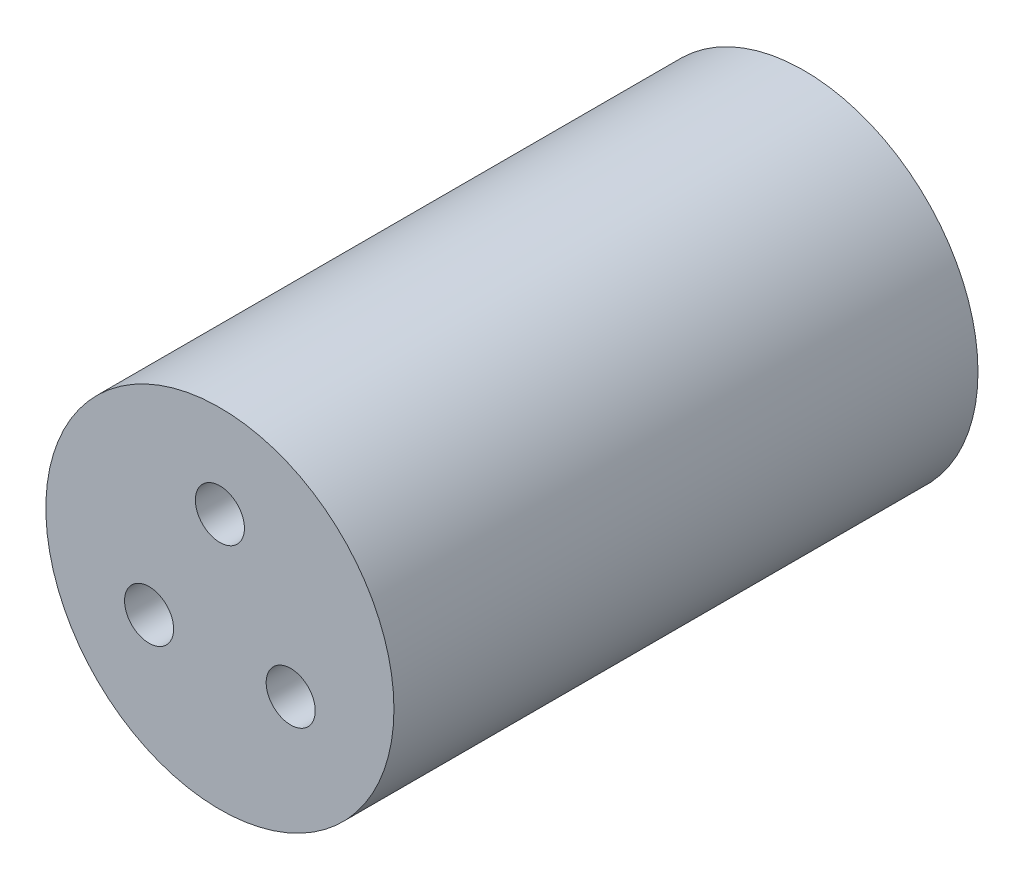
ISO-10303-21;
HEADER;
FILE_DESCRIPTION(('STEP AP214'),'2;1');
FILE_NAME('part.step','',(''),(''),'','','');
FILE_SCHEMA(('AUTOMOTIVE_DESIGN { 1 0 10303 214 1 1 1 1 }'));
ENDSEC;
DATA;
#1=APPLICATION_CONTEXT('core data for automotive mechanical design processes');
#2=APPLICATION_PROTOCOL_DEFINITION('international standard','automotive_design',2000,#1);
#3=PRODUCT_CONTEXT('',#1,'mechanical');
#4=PRODUCT('Part','Part','',(#3));
#5=PRODUCT_RELATED_PRODUCT_CATEGORY('part','',(#4));
#6=PRODUCT_DEFINITION_FORMATION('','',#4);
#7=PRODUCT_DEFINITION_CONTEXT('part definition',#1,'design');
#8=PRODUCT_DEFINITION('design','',#6,#7);
#9=PRODUCT_DEFINITION_SHAPE('','',#8);
#10=(LENGTH_UNIT() NAMED_UNIT(*) SI_UNIT(.MILLI.,.METRE.));
#11=(NAMED_UNIT(*) PLANE_ANGLE_UNIT() SI_UNIT($,.RADIAN.));
#12=(NAMED_UNIT(*) SI_UNIT($,.STERADIAN.) SOLID_ANGLE_UNIT());
#13=UNCERTAINTY_MEASURE_WITH_UNIT(LENGTH_MEASURE(1.E-05),#10,'distance_accuracy_value','');
#14=(GEOMETRIC_REPRESENTATION_CONTEXT(3) GLOBAL_UNCERTAINTY_ASSIGNED_CONTEXT((#13)) GLOBAL_UNIT_ASSIGNED_CONTEXT((#10,
#11,#12)) REPRESENTATION_CONTEXT('',''));
#15=CARTESIAN_POINT('',(0.,0.,0.));
#16=DIRECTION('',(0.,0.,1.));
#17=DIRECTION('',(1.,0.,0.));
#18=AXIS2_PLACEMENT_3D('',#15,#16,#17);
#19=CARTESIAN_POINT('',(0.,7.,50.));
#20=DIRECTION('',(0.,0.,-1.));
#21=DIRECTION('',(-1.,0.,0.));
#22=AXIS2_PLACEMENT_3D('',#19,#20,#21);
#23=CYLINDRICAL_SURFACE('',#22,1.7);
#24=CARTESIAN_POINT('',(0.,7.,44.3));
#25=DIRECTION('',(0.,0.,1.));
#26=DIRECTION('',(1.,0.,0.));
#27=AXIS2_PLACEMENT_3D('',#24,#25,#26);
#28=CIRCLE('',#27,1.7);
#29=CARTESIAN_POINT('',(1.7,7.,44.3));
#30=VERTEX_POINT('',#29);
#31=EDGE_CURVE('E58',#30,#30,#28,.T.);
#32=ORIENTED_EDGE('',*,*,#31,.T.);
#33=EDGE_LOOP('',(#32));
#34=FACE_BOUND('',#33,.T.);
#35=CARTESIAN_POINT('',(0.,7.,5.7));
#36=DIRECTION('',(0.,0.,-1.));
#37=DIRECTION('',(-1.,0.,0.));
#38=AXIS2_PLACEMENT_3D('',#35,#36,#37);
#39=CIRCLE('',#38,1.7);
#40=CARTESIAN_POINT('',(-1.7,7.,5.7));
#41=VERTEX_POINT('',#40);
#42=EDGE_CURVE('E47',#41,#41,#39,.T.);
#43=ORIENTED_EDGE('',*,*,#42,.T.);
#44=EDGE_LOOP('',(#43));
#45=FACE_BOUND('',#44,.T.);
#46=ADVANCED_FACE('F43',(#34,#45),#23,.F.);
#47=CARTESIAN_POINT('',(6.06217782649107,-3.5,50.));
#48=DIRECTION('',(0.,0.,-1.));
#49=DIRECTION('',(-1.,0.,0.));
#50=AXIS2_PLACEMENT_3D('',#47,#48,#49);
#51=CYLINDRICAL_SURFACE('',#50,1.7);
#52=CARTESIAN_POINT('',(6.06217782649107,-3.5,44.3));
#53=DIRECTION('',(0.,0.,1.));
#54=DIRECTION('',(1.,0.,0.));
#55=AXIS2_PLACEMENT_3D('',#52,#53,#54);
#56=CIRCLE('',#55,1.7);
#57=CARTESIAN_POINT('',(7.76217782649107,-3.5,44.3));
#58=VERTEX_POINT('',#57);
#59=EDGE_CURVE('E68',#58,#58,#56,.T.);
#60=ORIENTED_EDGE('',*,*,#59,.T.);
#61=EDGE_LOOP('',(#60));
#62=FACE_BOUND('',#61,.T.);
#63=CARTESIAN_POINT('',(6.06217782649107,-3.5,5.7));
#64=DIRECTION('',(0.,0.,-1.));
#65=DIRECTION('',(-1.,0.,0.));
#66=AXIS2_PLACEMENT_3D('',#63,#64,#65);
#67=CIRCLE('',#66,1.7);
#68=CARTESIAN_POINT('',(4.36217782649107,-3.5,5.7));
#69=VERTEX_POINT('',#68);
#70=EDGE_CURVE('E79',#69,#69,#67,.T.);
#71=ORIENTED_EDGE('',*,*,#70,.T.);
#72=EDGE_LOOP('',(#71));
#73=FACE_BOUND('',#72,.T.);
#74=ADVANCED_FACE('F151',(#62,#73),#51,.F.);
#75=CARTESIAN_POINT('',(-6.06217782649107,-3.5,50.));
#76=DIRECTION('',(0.,0.,-1.));
#77=DIRECTION('',(-1.,0.,0.));
#78=AXIS2_PLACEMENT_3D('',#75,#76,#77);
#79=CYLINDRICAL_SURFACE('',#78,1.7);
#80=CARTESIAN_POINT('',(-6.06217782649107,-3.5,44.3));
#81=DIRECTION('',(0.,0.,1.));
#82=DIRECTION('',(1.,0.,0.));
#83=AXIS2_PLACEMENT_3D('',#80,#81,#82);
#84=CIRCLE('',#83,1.7);
#85=CARTESIAN_POINT('',(-4.36217782649107,-3.5,44.3));
#86=VERTEX_POINT('',#85);
#87=EDGE_CURVE('E64',#86,#86,#84,.T.);
#88=ORIENTED_EDGE('',*,*,#87,.T.);
#89=EDGE_LOOP('',(#88));
#90=FACE_BOUND('',#89,.T.);
#91=CARTESIAN_POINT('',(-6.06217782649107,-3.5,5.7));
#92=DIRECTION('',(0.,0.,-1.));
#93=DIRECTION('',(-1.,0.,0.));
#94=AXIS2_PLACEMENT_3D('',#91,#92,#93);
#95=CIRCLE('',#94,1.7);
#96=CARTESIAN_POINT('',(-7.76217782649107,-3.5,5.7));
#97=VERTEX_POINT('',#96);
#98=EDGE_CURVE('E76',#97,#97,#95,.T.);
#99=ORIENTED_EDGE('',*,*,#98,.T.);
#100=EDGE_LOOP('',(#99));
#101=FACE_BOUND('',#100,.T.);
#102=ADVANCED_FACE('F158',(#90,#101),#79,.F.);
#103=CARTESIAN_POINT('',(0.,0.,50.));
#104=DIRECTION('',(0.,0.,1.));
#105=DIRECTION('',(1.,0.,0.));
#106=AXIS2_PLACEMENT_3D('',#103,#104,#105);
#107=PLANE('',#106);
#108=CARTESIAN_POINT('',(0.,7.,50.));
#109=DIRECTION('',(0.,0.,1.));
#110=DIRECTION('',(1.,0.,0.));
#111=AXIS2_PLACEMENT_3D('',#108,#109,#110);
#112=CIRCLE('',#111,2.1);
#113=CARTESIAN_POINT('',(2.1,7.,50.));
#114=VERTEX_POINT('',#113);
#115=EDGE_CURVE('E107',#114,#114,#112,.T.);
#116=ORIENTED_EDGE('',*,*,#115,.F.);
#117=EDGE_LOOP('',(#116));
#118=FACE_BOUND('',#117,.T.);
#119=CARTESIAN_POINT('',(6.06217782649107,-3.5,50.));
#120=DIRECTION('',(0.,0.,1.));
#121=DIRECTION('',(1.,0.,0.));
#122=AXIS2_PLACEMENT_3D('',#119,#120,#121);
#123=CIRCLE('',#122,2.1);
#124=CARTESIAN_POINT('',(8.16217782649107,-3.5,50.));
#125=VERTEX_POINT('',#124);
#126=EDGE_CURVE('E101',#125,#125,#123,.T.);
#127=ORIENTED_EDGE('',*,*,#126,.F.);
#128=EDGE_LOOP('',(#127));
#129=FACE_BOUND('',#128,.T.);
#130=CARTESIAN_POINT('',(-6.06217782649107,-3.5,50.));
#131=DIRECTION('',(0.,0.,1.));
#132=DIRECTION('',(1.,0.,0.));
#133=AXIS2_PLACEMENT_3D('',#130,#131,#132);
#134=CIRCLE('',#133,2.1);
#135=CARTESIAN_POINT('',(-3.96217782649107,-3.5,50.));
#136=VERTEX_POINT('',#135);
#137=EDGE_CURVE('E91',#136,#136,#134,.T.);
#138=ORIENTED_EDGE('',*,*,#137,.F.);
#139=EDGE_LOOP('',(#138));
#140=FACE_BOUND('',#139,.T.);
#141=CARTESIAN_POINT('',(0.,0.,50.));
#142=DIRECTION('',(0.,0.,1.));
#143=DIRECTION('',(1.,0.,0.));
#144=AXIS2_PLACEMENT_3D('',#141,#142,#143);
#145=CIRCLE('',#144,14.9);
#146=CARTESIAN_POINT('',(14.9,0.,50.));
#147=VERTEX_POINT('',#146);
#148=EDGE_CURVE('E10',#147,#147,#145,.T.);
#149=ORIENTED_EDGE('',*,*,#148,.T.);
#150=EDGE_LOOP('',(#149));
#151=FACE_BOUND('',#150,.T.);
#152=ADVANCED_FACE('F163',(#118,#129,#140,#151),#107,.T.);
#153=CARTESIAN_POINT('',(0.,0.,0.));
#154=DIRECTION('',(0.,0.,1.));
#155=DIRECTION('',(1.,0.,0.));
#156=AXIS2_PLACEMENT_3D('',#153,#154,#155);
#157=PLANE('',#156);
#158=CARTESIAN_POINT('',(0.,7.,0.));
#159=DIRECTION('',(0.,0.,1.));
#160=DIRECTION('',(1.,0.,0.));
#161=AXIS2_PLACEMENT_3D('',#158,#159,#160);
#162=CIRCLE('',#161,2.1);
#163=CARTESIAN_POINT('',(2.1,7.,0.));
#164=VERTEX_POINT('',#163);
#165=EDGE_CURVE('E130',#164,#164,#162,.T.);
#166=ORIENTED_EDGE('',*,*,#165,.T.);
#167=EDGE_LOOP('',(#166));
#168=FACE_BOUND('',#167,.T.);
#169=CARTESIAN_POINT('',(6.06217782649107,-3.5,0.));
#170=DIRECTION('',(0.,0.,1.));
#171=DIRECTION('',(1.,0.,0.));
#172=AXIS2_PLACEMENT_3D('',#169,#170,#171);
#173=CIRCLE('',#172,2.1);
#174=CARTESIAN_POINT('',(8.16217782649107,-3.5,0.));
#175=VERTEX_POINT('',#174);
#176=EDGE_CURVE('E122',#175,#175,#173,.T.);
#177=ORIENTED_EDGE('',*,*,#176,.T.);
#178=EDGE_LOOP('',(#177));
#179=FACE_BOUND('',#178,.T.);
#180=CARTESIAN_POINT('',(-6.06217782649107,-3.5,0.));
#181=DIRECTION('',(0.,0.,1.));
#182=DIRECTION('',(1.,0.,0.));
#183=AXIS2_PLACEMENT_3D('',#180,#181,#182);
#184=CIRCLE('',#183,2.1);
#185=CARTESIAN_POINT('',(-3.96217782649107,-3.5,0.));
#186=VERTEX_POINT('',#185);
#187=EDGE_CURVE('E114',#186,#186,#184,.T.);
#188=ORIENTED_EDGE('',*,*,#187,.T.);
#189=EDGE_LOOP('',(#188));
#190=FACE_BOUND('',#189,.T.);
#191=CARTESIAN_POINT('',(0.,0.,0.));
#192=DIRECTION('',(0.,0.,1.));
#193=DIRECTION('',(1.,0.,0.));
#194=AXIS2_PLACEMENT_3D('',#191,#192,#193);
#195=CIRCLE('',#194,14.9);
#196=CARTESIAN_POINT('',(14.9,0.,0.));
#197=VERTEX_POINT('',#196);
#198=EDGE_CURVE('E52',#197,#197,#195,.T.);
#199=ORIENTED_EDGE('',*,*,#198,.F.);
#200=EDGE_LOOP('',(#199));
#201=FACE_BOUND('',#200,.T.);
#202=ADVANCED_FACE('F165',(#168,#179,#190,#201),#157,.F.);
#203=CARTESIAN_POINT('',(0.,0.,50.));
#204=DIRECTION('',(0.,0.,-1.));
#205=DIRECTION('',(-1.,0.,0.));
#206=AXIS2_PLACEMENT_3D('',#203,#204,#205);
#207=CYLINDRICAL_SURFACE('',#206,14.9);
#208=ORIENTED_EDGE('',*,*,#148,.F.);
#209=EDGE_LOOP('',(#208));
#210=FACE_BOUND('',#209,.T.);
#211=ORIENTED_EDGE('',*,*,#198,.T.);
#212=EDGE_LOOP('',(#211));
#213=FACE_BOUND('',#212,.T.);
#214=ADVANCED_FACE('F45',(#210,#213),#207,.T.);
#215=CARTESIAN_POINT('',(-6.06217782649107,-3.5,44.3));
#216=DIRECTION('',(0.,0.,1.));
#217=DIRECTION('',(1.,0.,0.));
#218=AXIS2_PLACEMENT_3D('',#215,#216,#217);
#219=CYLINDRICAL_SURFACE('',#218,2.1);
#220=CARTESIAN_POINT('',(-6.06217782649107,-3.5,44.3));
#221=DIRECTION('',(0.,0.,1.));
#222=DIRECTION('',(1.,0.,0.));
#223=AXIS2_PLACEMENT_3D('',#220,#221,#222);
#224=CIRCLE('',#223,2.1);
#225=CARTESIAN_POINT('',(-3.96217782649107,-3.5,44.3));
#226=VERTEX_POINT('',#225);
#227=EDGE_CURVE('E61',#226,#226,#224,.T.);
#228=ORIENTED_EDGE('',*,*,#227,.F.);
#229=EDGE_LOOP('',(#228));
#230=FACE_BOUND('',#229,.T.);
#231=ORIENTED_EDGE('',*,*,#137,.T.);
#232=EDGE_LOOP('',(#231));
#233=FACE_BOUND('',#232,.T.);
#234=ADVANCED_FACE('F174',(#230,#233),#219,.F.);
#235=CARTESIAN_POINT('',(-6.06217782649107,-3.5,44.3));
#236=DIRECTION('',(0.,0.,1.));
#237=DIRECTION('',(1.,0.,0.));
#238=AXIS2_PLACEMENT_3D('',#235,#236,#237);
#239=PLANE('',#238);
#240=ORIENTED_EDGE('',*,*,#87,.F.);
#241=EDGE_LOOP('',(#240));
#242=FACE_BOUND('',#241,.T.);
#243=ORIENTED_EDGE('',*,*,#227,.T.);
#244=EDGE_LOOP('',(#243));
#245=FACE_BOUND('',#244,.T.);
#246=ADVANCED_FACE('F208',(#242,#245),#239,.T.);
#247=CARTESIAN_POINT('',(6.06217782649107,-3.5,44.3));
#248=DIRECTION('',(0.,0.,1.));
#249=DIRECTION('',(1.,0.,0.));
#250=AXIS2_PLACEMENT_3D('',#247,#248,#249);
#251=CYLINDRICAL_SURFACE('',#250,2.1);
#252=CARTESIAN_POINT('',(6.06217782649107,-3.5,44.3));
#253=DIRECTION('',(0.,0.,1.));
#254=DIRECTION('',(1.,0.,0.));
#255=AXIS2_PLACEMENT_3D('',#252,#253,#254);
#256=CIRCLE('',#255,2.1);
#257=CARTESIAN_POINT('',(8.16217782649107,-3.5,44.3));
#258=VERTEX_POINT('',#257);
#259=EDGE_CURVE('E96',#258,#258,#256,.T.);
#260=ORIENTED_EDGE('',*,*,#259,.F.);
#261=EDGE_LOOP('',(#260));
#262=FACE_BOUND('',#261,.T.);
#263=ORIENTED_EDGE('',*,*,#126,.T.);
#264=EDGE_LOOP('',(#263));
#265=FACE_BOUND('',#264,.T.);
#266=ADVANCED_FACE('F205',(#262,#265),#251,.F.);
#267=CARTESIAN_POINT('',(6.06217782649107,-3.5,44.3));
#268=DIRECTION('',(0.,0.,1.));
#269=DIRECTION('',(1.,0.,0.));
#270=AXIS2_PLACEMENT_3D('',#267,#268,#269);
#271=PLANE('',#270);
#272=ORIENTED_EDGE('',*,*,#59,.F.);
#273=EDGE_LOOP('',(#272));
#274=FACE_BOUND('',#273,.T.);
#275=ORIENTED_EDGE('',*,*,#259,.T.);
#276=EDGE_LOOP('',(#275));
#277=FACE_BOUND('',#276,.T.);
#278=ADVANCED_FACE('F203',(#274,#277),#271,.T.);
#279=CARTESIAN_POINT('',(0.,7.,44.3));
#280=DIRECTION('',(0.,0.,1.));
#281=DIRECTION('',(1.,0.,0.));
#282=AXIS2_PLACEMENT_3D('',#279,#280,#281);
#283=CYLINDRICAL_SURFACE('',#282,2.1);
#284=CARTESIAN_POINT('',(0.,7.,44.3));
#285=DIRECTION('',(0.,0.,1.));
#286=DIRECTION('',(1.,0.,0.));
#287=AXIS2_PLACEMENT_3D('',#284,#285,#286);
#288=CIRCLE('',#287,2.1);
#289=CARTESIAN_POINT('',(2.1,7.,44.3));
#290=VERTEX_POINT('',#289);
#291=EDGE_CURVE('E69',#290,#290,#288,.T.);
#292=ORIENTED_EDGE('',*,*,#291,.F.);
#293=EDGE_LOOP('',(#292));
#294=FACE_BOUND('',#293,.T.);
#295=ORIENTED_EDGE('',*,*,#115,.T.);
#296=EDGE_LOOP('',(#295));
#297=FACE_BOUND('',#296,.T.);
#298=ADVANCED_FACE('F196',(#294,#297),#283,.F.);
#299=CARTESIAN_POINT('',(0.,7.,44.3));
#300=DIRECTION('',(0.,0.,1.));
#301=DIRECTION('',(1.,0.,0.));
#302=AXIS2_PLACEMENT_3D('',#299,#300,#301);
#303=PLANE('',#302);
#304=ORIENTED_EDGE('',*,*,#31,.F.);
#305=EDGE_LOOP('',(#304));
#306=FACE_BOUND('',#305,.T.);
#307=ORIENTED_EDGE('',*,*,#291,.T.);
#308=EDGE_LOOP('',(#307));
#309=FACE_BOUND('',#308,.T.);
#310=ADVANCED_FACE('F187',(#306,#309),#303,.T.);
#311=CARTESIAN_POINT('',(-6.06217782649107,-3.5,5.7));
#312=DIRECTION('',(0.,0.,-1.));
#313=DIRECTION('',(-1.,0.,0.));
#314=AXIS2_PLACEMENT_3D('',#311,#312,#313);
#315=CYLINDRICAL_SURFACE('',#314,2.1);
#316=CARTESIAN_POINT('',(-6.06217782649107,-3.5,5.7));
#317=DIRECTION('',(0.,0.,1.));
#318=DIRECTION('',(1.,0.,0.));
#319=AXIS2_PLACEMENT_3D('',#316,#317,#318);
#320=CIRCLE('',#319,2.1);
#321=CARTESIAN_POINT('',(-3.96217782649107,-3.5,5.7));
#322=VERTEX_POINT('',#321);
#323=EDGE_CURVE('E118',#322,#322,#320,.T.);
#324=ORIENTED_EDGE('',*,*,#323,.T.);
#325=EDGE_LOOP('',(#324));
#326=FACE_BOUND('',#325,.T.);
#327=ORIENTED_EDGE('',*,*,#187,.F.);
#328=EDGE_LOOP('',(#327));
#329=FACE_BOUND('',#328,.T.);
#330=ADVANCED_FACE('F185',(#326,#329),#315,.F.);
#331=CARTESIAN_POINT('',(-6.06217782649107,-3.5,5.7));
#332=DIRECTION('',(0.,0.,-1.));
#333=DIRECTION('',(1.,0.,0.));
#334=AXIS2_PLACEMENT_3D('',#331,#332,#333);
#335=PLANE('',#334);
#336=ORIENTED_EDGE('',*,*,#98,.F.);
#337=EDGE_LOOP('',(#336));
#338=FACE_BOUND('',#337,.T.);
#339=ORIENTED_EDGE('',*,*,#323,.F.);
#340=EDGE_LOOP('',(#339));
#341=FACE_BOUND('',#340,.T.);
#342=ADVANCED_FACE('F186',(#338,#341),#335,.T.);
#343=CARTESIAN_POINT('',(6.06217782649107,-3.5,5.7));
#344=DIRECTION('',(0.,0.,-1.));
#345=DIRECTION('',(-1.,0.,0.));
#346=AXIS2_PLACEMENT_3D('',#343,#344,#345);
#347=CYLINDRICAL_SURFACE('',#346,2.1);
#348=CARTESIAN_POINT('',(6.06217782649107,-3.5,5.7));
#349=DIRECTION('',(0.,0.,1.));
#350=DIRECTION('',(1.,0.,0.));
#351=AXIS2_PLACEMENT_3D('',#348,#349,#350);
#352=CIRCLE('',#351,2.1);
#353=CARTESIAN_POINT('',(8.16217782649107,-3.5,5.7));
#354=VERTEX_POINT('',#353);
#355=EDGE_CURVE('E126',#354,#354,#352,.T.);
#356=ORIENTED_EDGE('',*,*,#355,.T.);
#357=EDGE_LOOP('',(#356));
#358=FACE_BOUND('',#357,.T.);
#359=ORIENTED_EDGE('',*,*,#176,.F.);
#360=EDGE_LOOP('',(#359));
#361=FACE_BOUND('',#360,.T.);
#362=ADVANCED_FACE('F193',(#358,#361),#347,.F.);
#363=CARTESIAN_POINT('',(6.06217782649107,-3.5,5.7));
#364=DIRECTION('',(0.,0.,-1.));
#365=DIRECTION('',(1.,0.,0.));
#366=AXIS2_PLACEMENT_3D('',#363,#364,#365);
#367=PLANE('',#366);
#368=ORIENTED_EDGE('',*,*,#70,.F.);
#369=EDGE_LOOP('',(#368));
#370=FACE_BOUND('',#369,.T.);
#371=ORIENTED_EDGE('',*,*,#355,.F.);
#372=EDGE_LOOP('',(#371));
#373=FACE_BOUND('',#372,.T.);
#374=ADVANCED_FACE('F148',(#370,#373),#367,.T.);
#375=CARTESIAN_POINT('',(0.,7.,5.7));
#376=DIRECTION('',(0.,0.,-1.));
#377=DIRECTION('',(-1.,0.,0.));
#378=AXIS2_PLACEMENT_3D('',#375,#376,#377);
#379=CYLINDRICAL_SURFACE('',#378,2.1);
#380=CARTESIAN_POINT('',(0.,7.,5.7));
#381=DIRECTION('',(0.,0.,1.));
#382=DIRECTION('',(1.,0.,0.));
#383=AXIS2_PLACEMENT_3D('',#380,#381,#382);
#384=CIRCLE('',#383,2.1);
#385=CARTESIAN_POINT('',(2.1,7.,5.7));
#386=VERTEX_POINT('',#385);
#387=EDGE_CURVE('E80',#386,#386,#384,.T.);
#388=ORIENTED_EDGE('',*,*,#387,.T.);
#389=EDGE_LOOP('',(#388));
#390=FACE_BOUND('',#389,.T.);
#391=ORIENTED_EDGE('',*,*,#165,.F.);
#392=EDGE_LOOP('',(#391));
#393=FACE_BOUND('',#392,.T.);
#394=ADVANCED_FACE('F138',(#390,#393),#379,.F.);
#395=CARTESIAN_POINT('',(0.,7.,5.7));
#396=DIRECTION('',(0.,0.,-1.));
#397=DIRECTION('',(1.,0.,0.));
#398=AXIS2_PLACEMENT_3D('',#395,#396,#397);
#399=PLANE('',#398);
#400=ORIENTED_EDGE('',*,*,#42,.F.);
#401=EDGE_LOOP('',(#400));
#402=FACE_BOUND('',#401,.T.);
#403=ORIENTED_EDGE('',*,*,#387,.F.);
#404=EDGE_LOOP('',(#403));
#405=FACE_BOUND('',#404,.T.);
#406=ADVANCED_FACE('F141',(#402,#405),#399,.T.);
#407=CLOSED_SHELL('',(#46,#74,#102,#152,#202,#214,#234,#246,#266,#278,#298,#310,#330,#342,#362,
#374,#394,#406));
#408=MANIFOLD_SOLID_BREP('B2',#407);
#409=ADVANCED_BREP_SHAPE_REPRESENTATION('',(#18,#408),#14);
#410=SHAPE_DEFINITION_REPRESENTATION(#9,#409);
ENDSEC;
END-ISO-10303-21;
